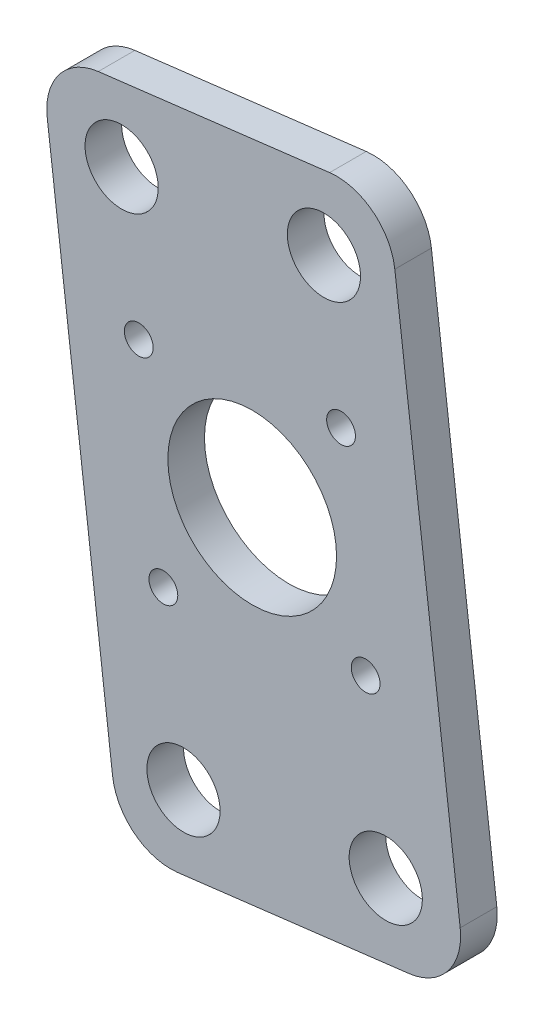
ISO-10303-21;
HEADER;
FILE_DESCRIPTION(('STEP AP214'),'2;1');
FILE_NAME('part.step','',(''),(''),'','','');
FILE_SCHEMA(('AUTOMOTIVE_DESIGN { 1 0 10303 214 1 1 1 1 }'));
ENDSEC;
DATA;
#1=APPLICATION_CONTEXT('core data for automotive mechanical design processes');
#2=APPLICATION_PROTOCOL_DEFINITION('international standard','automotive_design',2000,#1);
#3=PRODUCT_CONTEXT('',#1,'mechanical');
#4=PRODUCT('Part','Part','',(#3));
#5=PRODUCT_RELATED_PRODUCT_CATEGORY('part','',(#4));
#6=PRODUCT_DEFINITION_FORMATION('','',#4);
#7=PRODUCT_DEFINITION_CONTEXT('part definition',#1,'design');
#8=PRODUCT_DEFINITION('design','',#6,#7);
#9=PRODUCT_DEFINITION_SHAPE('','',#8);
#10=(LENGTH_UNIT() NAMED_UNIT(*) SI_UNIT(.MILLI.,.METRE.));
#11=(NAMED_UNIT(*) PLANE_ANGLE_UNIT() SI_UNIT($,.RADIAN.));
#12=(NAMED_UNIT(*) SI_UNIT($,.STERADIAN.) SOLID_ANGLE_UNIT());
#13=UNCERTAINTY_MEASURE_WITH_UNIT(LENGTH_MEASURE(1.E-05),#10,'distance_accuracy_value','');
#14=(GEOMETRIC_REPRESENTATION_CONTEXT(3) GLOBAL_UNCERTAINTY_ASSIGNED_CONTEXT((#13)) GLOBAL_UNIT_ASSIGNED_CONTEXT((#10,
#11,#12)) REPRESENTATION_CONTEXT('',''));
#15=CARTESIAN_POINT('',(0.,0.,0.));
#16=DIRECTION('',(0.,0.,1.));
#17=DIRECTION('',(1.,0.,0.));
#18=AXIS2_PLACEMENT_3D('',#15,#16,#17);
#19=CARTESIAN_POINT('',(-103.141929346554,-135.150875755682,3.175));
#20=DIRECTION('',(0.,0.,-1.));
#21=DIRECTION('',(-1.,0.,0.));
#22=AXIS2_PLACEMENT_3D('',#19,#20,#21);
#23=CYLINDRICAL_SURFACE('',#22,5.08000000000002);
#24=CARTESIAN_POINT('',(-103.141929346554,-135.150875755682,0.));
#25=DIRECTION('',(0.,0.,1.));
#26=DIRECTION('',(1.,0.,0.));
#27=AXIS2_PLACEMENT_3D('',#24,#25,#26);
#28=CIRCLE('',#27,5.08000000000002);
#29=CARTESIAN_POINT('',(-108.184781590121,-135.764097778734,0.));
#30=VERTEX_POINT('',#29);
#31=CARTESIAN_POINT('',(-103.755151369607,-130.108023512115,0.));
#32=VERTEX_POINT('',#31);
#33=EDGE_CURVE('E157',#30,#32,#28,.F.);
#34=ORIENTED_EDGE('',*,*,#33,.F.);
#35=DIRECTION('',(0.,0.,-1.));
#36=VECTOR('',#35,1.);
#37=CARTESIAN_POINT('',(-108.184781590121,-135.764097778734,3.175));
#38=LINE('',#37,#36);
#39=CARTESIAN_POINT('',(-108.184781590121,-135.764097778734,3.175));
#40=VERTEX_POINT('',#39);
#41=EDGE_CURVE('E11',#40,#30,#38,.T.);
#42=ORIENTED_EDGE('',*,*,#41,.F.);
#43=CARTESIAN_POINT('',(-103.141929346554,-135.150875755682,3.175));
#44=DIRECTION('',(0.,0.,1.));
#45=DIRECTION('',(1.,0.,0.));
#46=AXIS2_PLACEMENT_3D('',#43,#44,#45);
#47=CIRCLE('',#46,5.08000000000002);
#48=CARTESIAN_POINT('',(-103.755151369607,-130.108023512115,3.175));
#49=VERTEX_POINT('',#48);
#50=EDGE_CURVE('E280',#40,#49,#47,.F.);
#51=ORIENTED_EDGE('',*,*,#50,.T.);
#52=DIRECTION('',(0.,0.,-1.));
#53=VECTOR('',#52,1.);
#54=CARTESIAN_POINT('',(-103.755151369607,-130.108023512115,3.175));
#55=LINE('',#54,#53);
#56=EDGE_CURVE('E90',#49,#32,#55,.T.);
#57=ORIENTED_EDGE('',*,*,#56,.T.);
#58=EDGE_LOOP('',(#34,#42,#51,#57));
#59=FACE_BOUND('',#58,.T.);
#60=ADVANCED_FACE('F39',(#59),#23,.T.);
#61=CARTESIAN_POINT('',(-122.87700265867,-14.9421161909158,3.175));
#62=DIRECTION('',(0.992687449520956,0.1207129966639,0.));
#63=DIRECTION('',(-0.1207129966639,0.992687449520957,0.));
#64=AXIS2_PLACEMENT_3D('',#61,#62,#63);
#65=PLANE('',#64);
#66=DIRECTION('',(0.1207129966639,-0.992687449520957,0.));
#67=VECTOR('',#66,1.);
#68=CARTESIAN_POINT('',(-122.87700265867,-14.9421161909158,0.));
#69=LINE('',#68,#67);
#70=CARTESIAN_POINT('',(-102.512477876884,-182.410481031724,0.));
#71=VERTEX_POINT('',#70);
#72=EDGE_CURVE('E155',#30,#71,#69,.T.);
#73=ORIENTED_EDGE('',*,*,#72,.T.);
#74=DIRECTION('',(0.,0.,-1.));
#75=VECTOR('',#74,1.);
#76=CARTESIAN_POINT('',(-102.512477876884,-182.410481031724,3.175));
#77=LINE('',#76,#75);
#78=CARTESIAN_POINT('',(-102.512477876884,-182.410481031724,3.175));
#79=VERTEX_POINT('',#78);
#80=EDGE_CURVE('E48',#79,#71,#77,.T.);
#81=ORIENTED_EDGE('',*,*,#80,.F.);
#82=DIRECTION('',(0.1207129966639,-0.992687449520957,0.));
#83=VECTOR('',#82,1.);
#84=CARTESIAN_POINT('',(-122.87700265867,-14.9421161909158,3.175));
#85=LINE('',#84,#83);
#86=EDGE_CURVE('E282',#40,#79,#85,.T.);
#87=ORIENTED_EDGE('',*,*,#86,.F.);
#88=ORIENTED_EDGE('',*,*,#41,.T.);
#89=EDGE_LOOP('',(#73,#81,#87,#88));
#90=FACE_BOUND('',#89,.T.);
#91=ADVANCED_FACE('F156',(#90),#65,.F.);
#92=CARTESIAN_POINT('',(-97.4696256333176,-181.797259008671,3.175));
#93=DIRECTION('',(0.,0.,-1.));
#94=DIRECTION('',(-1.,0.,0.));
#95=AXIS2_PLACEMENT_3D('',#92,#93,#94);
#96=CYLINDRICAL_SURFACE('',#95,5.07999999999996);
#97=CARTESIAN_POINT('',(-97.4696256333176,-181.797259008671,0.));
#98=DIRECTION('',(0.,0.,1.));
#99=DIRECTION('',(1.,0.,0.));
#100=AXIS2_PLACEMENT_3D('',#97,#98,#99);
#101=CIRCLE('',#100,5.07999999999996);
#102=CARTESIAN_POINT('',(-96.856403610265,-186.840111252238,0.));
#103=VERTEX_POINT('',#102);
#104=EDGE_CURVE('E149',#71,#103,#101,.T.);
#105=ORIENTED_EDGE('',*,*,#104,.T.);
#106=DIRECTION('',(0.,0.,-1.));
#107=VECTOR('',#106,1.);
#108=CARTESIAN_POINT('',(-96.856403610265,-186.840111252238,3.175));
#109=LINE('',#108,#107);
#110=CARTESIAN_POINT('',(-96.856403610265,-186.840111252238,3.175));
#111=VERTEX_POINT('',#110);
#112=EDGE_CURVE('E140',#111,#103,#109,.T.);
#113=ORIENTED_EDGE('',*,*,#112,.F.);
#114=CARTESIAN_POINT('',(-97.4696256333176,-181.797259008671,3.175));
#115=DIRECTION('',(0.,0.,1.));
#116=DIRECTION('',(1.,0.,0.));
#117=AXIS2_PLACEMENT_3D('',#114,#115,#116);
#118=CIRCLE('',#117,5.07999999999996);
#119=EDGE_CURVE('E151',#79,#111,#118,.T.);
#120=ORIENTED_EDGE('',*,*,#119,.F.);
#121=ORIENTED_EDGE('',*,*,#80,.T.);
#122=EDGE_LOOP('',(#105,#113,#120,#121));
#123=FACE_BOUND('',#122,.T.);
#124=ADVANCED_FACE('F147',(#123),#96,.T.);
#125=CARTESIAN_POINT('',(20.9777468048383,-172.511217084375,3.175));
#126=DIRECTION('',(-0.120712996663899,0.992687449520957,0.));
#127=DIRECTION('',(-0.992687449520957,-0.120712996663899,0.));
#128=AXIS2_PLACEMENT_3D('',#125,#126,#127);
#129=PLANE('',#128);
#130=DIRECTION('',(0.992687449520957,0.120712996663899,0.));
#131=VECTOR('',#130,1.);
#132=CARTESIAN_POINT('',(20.9777468048383,-172.511217084375,0.));
#133=LINE('',#132,#131);
#134=CARTESIAN_POINT('',(-76.7865768096056,-184.399575777752,0.));
#135=VERTEX_POINT('',#134);
#136=EDGE_CURVE('E159',#103,#135,#133,.T.);
#137=ORIENTED_EDGE('',*,*,#136,.T.);
#138=DIRECTION('',(0.,0.,-1.));
#139=VECTOR('',#138,1.);
#140=CARTESIAN_POINT('',(-76.7865768096056,-184.399575777752,3.175));
#141=LINE('',#140,#139);
#142=CARTESIAN_POINT('',(-76.7865768096056,-184.399575777752,3.175));
#143=VERTEX_POINT('',#142);
#144=EDGE_CURVE('E133',#143,#135,#141,.T.);
#145=ORIENTED_EDGE('',*,*,#144,.F.);
#146=DIRECTION('',(0.992687449520957,0.120712996663899,0.));
#147=VECTOR('',#146,1.);
#148=CARTESIAN_POINT('',(20.9777468048383,-172.511217084375,3.175));
#149=LINE('',#148,#147);
#150=EDGE_CURVE('E287',#111,#143,#149,.T.);
#151=ORIENTED_EDGE('',*,*,#150,.F.);
#152=ORIENTED_EDGE('',*,*,#112,.T.);
#153=EDGE_LOOP('',(#137,#145,#151,#152));
#154=FACE_BOUND('',#153,.T.);
#155=ADVANCED_FACE('F234',(#154),#129,.F.);
#156=CARTESIAN_POINT('',(-77.3997988326582,-179.356723534185,3.175));
#157=DIRECTION('',(0.,0.,-1.));
#158=DIRECTION('',(-1.,0.,0.));
#159=AXIS2_PLACEMENT_3D('',#156,#157,#158);
#160=CYLINDRICAL_SURFACE('',#159,5.07999999999998);
#161=CARTESIAN_POINT('',(-77.3997988326582,-179.356723534185,0.));
#162=DIRECTION('',(0.,0.,1.));
#163=DIRECTION('',(1.,0.,0.));
#164=AXIS2_PLACEMENT_3D('',#161,#162,#163);
#165=CIRCLE('',#164,5.07999999999998);
#166=CARTESIAN_POINT('',(-72.3569465890917,-178.743501511133,0.));
#167=VERTEX_POINT('',#166);
#168=EDGE_CURVE('E167',#135,#167,#165,.T.);
#169=ORIENTED_EDGE('',*,*,#168,.T.);
#170=DIRECTION('',(0.,0.,-1.));
#171=VECTOR('',#170,1.);
#172=CARTESIAN_POINT('',(-72.3569465890917,-178.743501511133,3.175));
#173=LINE('',#172,#171);
#174=CARTESIAN_POINT('',(-72.3569465890917,-178.743501511133,3.175));
#175=VERTEX_POINT('',#174);
#176=EDGE_CURVE('E131',#175,#167,#173,.T.);
#177=ORIENTED_EDGE('',*,*,#176,.F.);
#178=CARTESIAN_POINT('',(-77.3997988326582,-179.356723534185,3.175));
#179=DIRECTION('',(0.,0.,1.));
#180=DIRECTION('',(1.,0.,0.));
#181=AXIS2_PLACEMENT_3D('',#178,#179,#180);
#182=CIRCLE('',#181,5.07999999999998);
#183=EDGE_CURVE('E124',#143,#175,#182,.T.);
#184=ORIENTED_EDGE('',*,*,#183,.F.);
#185=ORIENTED_EDGE('',*,*,#144,.T.);
#186=EDGE_LOOP('',(#169,#177,#184,#185));
#187=FACE_BOUND('',#186,.T.);
#188=ADVANCED_FACE('F237',(#187),#160,.T.);
#189=CARTESIAN_POINT('',(-92.7214713708774,-11.2751366703244,3.175));
#190=DIRECTION('',(-0.992687449520956,-0.120712996663899,0.));
#191=DIRECTION('',(0.120712996663899,-0.992687449520957,0.));
#192=AXIS2_PLACEMENT_3D('',#189,#190,#191);
#193=PLANE('',#192);
#194=DIRECTION('',(-0.120712996663899,0.992687449520957,0.));
#195=VECTOR('',#194,1.);
#196=CARTESIAN_POINT('',(-92.7214713708774,-11.2751366703244,0.));
#197=LINE('',#196,#195);
#198=CARTESIAN_POINT('',(-78.0292503023284,-132.097118258143,0.));
#199=VERTEX_POINT('',#198);
#200=EDGE_CURVE('E130',#167,#199,#197,.T.);
#201=ORIENTED_EDGE('',*,*,#200,.T.);
#202=DIRECTION('',(0.,0.,-1.));
#203=VECTOR('',#202,1.);
#204=CARTESIAN_POINT('',(-78.0292503023284,-132.097118258143,3.175));
#205=LINE('',#204,#203);
#206=CARTESIAN_POINT('',(-78.0292503023284,-132.097118258143,3.175));
#207=VERTEX_POINT('',#206);
#208=EDGE_CURVE('E115',#207,#199,#205,.T.);
#209=ORIENTED_EDGE('',*,*,#208,.F.);
#210=DIRECTION('',(-0.120712996663899,0.992687449520957,0.));
#211=VECTOR('',#210,1.);
#212=CARTESIAN_POINT('',(-92.7214713708774,-11.2751366703244,3.175));
#213=LINE('',#212,#211);
#214=EDGE_CURVE('E118',#175,#207,#213,.T.);
#215=ORIENTED_EDGE('',*,*,#214,.F.);
#216=ORIENTED_EDGE('',*,*,#176,.T.);
#217=EDGE_LOOP('',(#201,#209,#215,#216));
#218=FACE_BOUND('',#217,.T.);
#219=ADVANCED_FACE('F129',(#218),#193,.F.);
#220=CARTESIAN_POINT('',(-83.0721025458948,-132.710340281196,3.175));
#221=DIRECTION('',(0.,0.,-1.));
#222=DIRECTION('',(-1.,0.,0.));
#223=AXIS2_PLACEMENT_3D('',#220,#221,#222);
#224=CYLINDRICAL_SURFACE('',#223,5.08000000000002);
#225=CARTESIAN_POINT('',(-83.0721025458948,-132.710340281196,0.));
#226=DIRECTION('',(0.,0.,1.));
#227=DIRECTION('',(1.,0.,0.));
#228=AXIS2_PLACEMENT_3D('',#225,#226,#227);
#229=CIRCLE('',#228,5.08000000000002);
#230=CARTESIAN_POINT('',(-83.6853245689475,-127.667488037629,0.));
#231=VERTEX_POINT('',#230);
#232=EDGE_CURVE('E171',#199,#231,#229,.T.);
#233=ORIENTED_EDGE('',*,*,#232,.T.);
#234=DIRECTION('',(0.,0.,-1.));
#235=VECTOR('',#234,1.);
#236=CARTESIAN_POINT('',(-83.6853245689475,-127.667488037629,3.175));
#237=LINE('',#236,#235);
#238=CARTESIAN_POINT('',(-83.6853245689475,-127.667488037629,3.175));
#239=VERTEX_POINT('',#238);
#240=EDGE_CURVE('E117',#239,#231,#237,.T.);
#241=ORIENTED_EDGE('',*,*,#240,.F.);
#242=CARTESIAN_POINT('',(-83.0721025458948,-132.710340281196,3.175));
#243=DIRECTION('',(0.,0.,1.));
#244=DIRECTION('',(1.,0.,0.));
#245=AXIS2_PLACEMENT_3D('',#242,#243,#244);
#246=CIRCLE('',#245,5.08000000000002);
#247=EDGE_CURVE('E110',#207,#239,#246,.T.);
#248=ORIENTED_EDGE('',*,*,#247,.F.);
#249=ORIENTED_EDGE('',*,*,#208,.T.);
#250=EDGE_LOOP('',(#233,#241,#248,#249));
#251=FACE_BOUND('',#250,.T.);
#252=ADVANCED_FACE('F113',(#251),#224,.T.);
#253=CARTESIAN_POINT('',(-80.55927811051,-163.895460225963,3.175));
#254=DIRECTION('',(0.,0.,-1.));
#255=DIRECTION('',(-1.,0.,0.));
#256=AXIS2_PLACEMENT_3D('',#253,#254,#255);
#257=CYLINDRICAL_SURFACE('',#256,1.25);
#258=CARTESIAN_POINT('',(-80.55927811051,-163.895460225963,3.175));
#259=DIRECTION('',(0.,0.,1.));
#260=DIRECTION('',(1.,0.,0.));
#261=AXIS2_PLACEMENT_3D('',#258,#259,#260);
#262=CIRCLE('',#261,1.25);
#263=CARTESIAN_POINT('',(-79.30927811051,-163.895460225963,3.175));
#264=VERTEX_POINT('',#263);
#265=EDGE_CURVE('E200',#264,#264,#262,.T.);
#266=ORIENTED_EDGE('',*,*,#265,.T.);
#267=EDGE_LOOP('',(#266));
#268=FACE_BOUND('',#267,.T.);
#269=CARTESIAN_POINT('',(-80.55927811051,-163.895460225963,0.));
#270=DIRECTION('',(0.,0.,1.));
#271=DIRECTION('',(1.,0.,0.));
#272=AXIS2_PLACEMENT_3D('',#269,#270,#271);
#273=CIRCLE('',#272,1.25);
#274=CARTESIAN_POINT('',(-79.30927811051,-163.895460225963,0.));
#275=VERTEX_POINT('',#274);
#276=EDGE_CURVE('E192',#275,#275,#273,.T.);
#277=ORIENTED_EDGE('',*,*,#276,.F.);
#278=EDGE_LOOP('',(#277));
#279=FACE_BOUND('',#278,.T.);
#280=ADVANCED_FACE('F245',(#268,#279),#257,.F.);
#281=CARTESIAN_POINT('',(-82.6932025734698,-146.347059547087,3.175));
#282=DIRECTION('',(0.,0.,-1.));
#283=DIRECTION('',(-1.,0.,0.));
#284=AXIS2_PLACEMENT_3D('',#281,#282,#283);
#285=CYLINDRICAL_SURFACE('',#284,1.25);
#286=CARTESIAN_POINT('',(-82.6932025734698,-146.347059547087,3.175));
#287=DIRECTION('',(0.,0.,1.));
#288=DIRECTION('',(1.,0.,0.));
#289=AXIS2_PLACEMENT_3D('',#286,#287,#288);
#290=CIRCLE('',#289,1.25);
#291=CARTESIAN_POINT('',(-81.4432025734698,-146.347059547087,3.175));
#292=VERTEX_POINT('',#291);
#293=EDGE_CURVE('E205',#292,#292,#290,.T.);
#294=ORIENTED_EDGE('',*,*,#293,.T.);
#295=EDGE_LOOP('',(#294));
#296=FACE_BOUND('',#295,.T.);
#297=CARTESIAN_POINT('',(-82.6932025734698,-146.347059547087,0.));
#298=DIRECTION('',(0.,0.,1.));
#299=DIRECTION('',(1.,0.,0.));
#300=AXIS2_PLACEMENT_3D('',#297,#298,#299);
#301=CIRCLE('',#300,1.25);
#302=CARTESIAN_POINT('',(-81.4432025734698,-146.347059547087,0.));
#303=VERTEX_POINT('',#302);
#304=EDGE_CURVE('E189',#303,#303,#301,.T.);
#305=ORIENTED_EDGE('',*,*,#304,.F.);
#306=EDGE_LOOP('',(#305));
#307=FACE_BOUND('',#306,.T.);
#308=ADVANCED_FACE('F265',(#296,#307),#285,.F.);
#309=CARTESIAN_POINT('',(-100.241603252346,-148.480984010047,3.175));
#310=DIRECTION('',(0.,0.,-1.));
#311=DIRECTION('',(-1.,0.,0.));
#312=AXIS2_PLACEMENT_3D('',#309,#310,#311);
#313=CYLINDRICAL_SURFACE('',#312,1.25);
#314=CARTESIAN_POINT('',(-100.241603252346,-148.480984010047,3.175));
#315=DIRECTION('',(0.,0.,1.));
#316=DIRECTION('',(1.,0.,0.));
#317=AXIS2_PLACEMENT_3D('',#314,#315,#316);
#318=CIRCLE('',#317,1.25);
#319=CARTESIAN_POINT('',(-98.991603252346,-148.480984010047,3.175));
#320=VERTEX_POINT('',#319);
#321=EDGE_CURVE('E303',#320,#320,#318,.T.);
#322=ORIENTED_EDGE('',*,*,#321,.T.);
#323=EDGE_LOOP('',(#322));
#324=FACE_BOUND('',#323,.T.);
#325=CARTESIAN_POINT('',(-100.241603252346,-148.480984010047,0.));
#326=DIRECTION('',(0.,0.,1.));
#327=DIRECTION('',(1.,0.,0.));
#328=AXIS2_PLACEMENT_3D('',#325,#326,#327);
#329=CIRCLE('',#328,1.25);
#330=CARTESIAN_POINT('',(-98.991603252346,-148.480984010047,0.));
#331=VERTEX_POINT('',#330);
#332=EDGE_CURVE('E186',#331,#331,#329,.T.);
#333=ORIENTED_EDGE('',*,*,#332,.F.);
#334=EDGE_LOOP('',(#333));
#335=FACE_BOUND('',#334,.T.);
#336=ADVANCED_FACE('F261',(#324,#335),#313,.F.);
#337=CARTESIAN_POINT('',(-101.7279107799,-136.25828331081,3.175));
#338=DIRECTION('',(0.,0.,-1.));
#339=DIRECTION('',(-1.,0.,0.));
#340=AXIS2_PLACEMENT_3D('',#337,#338,#339);
#341=CYLINDRICAL_SURFACE('',#340,3.175);
#342=CARTESIAN_POINT('',(-101.7279107799,-136.25828331081,3.175));
#343=DIRECTION('',(0.,0.,1.));
#344=DIRECTION('',(1.,0.,0.));
#345=AXIS2_PLACEMENT_3D('',#342,#343,#344);
#346=CIRCLE('',#345,3.175);
#347=CARTESIAN_POINT('',(-98.5529107798995,-136.25828331081,3.175));
#348=VERTEX_POINT('',#347);
#349=EDGE_CURVE('E300',#348,#348,#346,.T.);
#350=ORIENTED_EDGE('',*,*,#349,.T.);
#351=EDGE_LOOP('',(#350));
#352=FACE_BOUND('',#351,.T.);
#353=CARTESIAN_POINT('',(-101.7279107799,-136.25828331081,0.));
#354=DIRECTION('',(0.,0.,1.));
#355=DIRECTION('',(1.,0.,0.));
#356=AXIS2_PLACEMENT_3D('',#353,#354,#355);
#357=CIRCLE('',#356,3.175);
#358=CARTESIAN_POINT('',(-98.5529107798995,-136.25828331081,0.));
#359=VERTEX_POINT('',#358);
#360=EDGE_CURVE('E183',#359,#359,#357,.T.);
#361=ORIENTED_EDGE('',*,*,#360,.F.);
#362=EDGE_LOOP('',(#361));
#363=FACE_BOUND('',#362,.T.);
#364=ADVANCED_FACE('F257',(#352,#363),#341,.F.);
#365=CARTESIAN_POINT('',(-84.1795101010233,-134.12435884785,3.175));
#366=DIRECTION('',(0.,0.,-1.));
#367=DIRECTION('',(-1.,0.,0.));
#368=AXIS2_PLACEMENT_3D('',#365,#366,#367);
#369=CYLINDRICAL_SURFACE('',#368,3.175);
#370=CARTESIAN_POINT('',(-84.1795101010233,-134.12435884785,3.175));
#371=DIRECTION('',(0.,0.,1.));
#372=DIRECTION('',(1.,0.,0.));
#373=AXIS2_PLACEMENT_3D('',#370,#371,#372);
#374=CIRCLE('',#373,3.175);
#375=CARTESIAN_POINT('',(-81.0045101010233,-134.12435884785,3.175));
#376=VERTEX_POINT('',#375);
#377=EDGE_CURVE('E297',#376,#376,#374,.T.);
#378=ORIENTED_EDGE('',*,*,#377,.T.);
#379=EDGE_LOOP('',(#378));
#380=FACE_BOUND('',#379,.T.);
#381=CARTESIAN_POINT('',(-84.1795101010233,-134.12435884785,0.));
#382=DIRECTION('',(0.,0.,1.));
#383=DIRECTION('',(1.,0.,0.));
#384=AXIS2_PLACEMENT_3D('',#381,#382,#383);
#385=CIRCLE('',#384,3.175);
#386=CARTESIAN_POINT('',(-81.0045101010233,-134.12435884785,0.));
#387=VERTEX_POINT('',#386);
#388=EDGE_CURVE('E180',#387,#387,#385,.T.);
#389=ORIENTED_EDGE('',*,*,#388,.F.);
#390=EDGE_LOOP('',(#389));
#391=FACE_BOUND('',#390,.T.);
#392=ADVANCED_FACE('F253',(#380,#391),#369,.F.);
#393=CARTESIAN_POINT('',(-78.813817399313,-178.249315979057,3.175));
#394=DIRECTION('',(0.,0.,-1.));
#395=DIRECTION('',(-1.,0.,0.));
#396=AXIS2_PLACEMENT_3D('',#393,#394,#395);
#397=CYLINDRICAL_SURFACE('',#396,3.175);
#398=CARTESIAN_POINT('',(-78.813817399313,-178.249315979057,3.175));
#399=DIRECTION('',(0.,0.,1.));
#400=DIRECTION('',(1.,0.,0.));
#401=AXIS2_PLACEMENT_3D('',#398,#399,#400);
#402=CIRCLE('',#401,3.175);
#403=CARTESIAN_POINT('',(-75.638817399313,-178.249315979057,3.175));
#404=VERTEX_POINT('',#403);
#405=EDGE_CURVE('E294',#404,#404,#402,.T.);
#406=ORIENTED_EDGE('',*,*,#405,.T.);
#407=EDGE_LOOP('',(#406));
#408=FACE_BOUND('',#407,.T.);
#409=CARTESIAN_POINT('',(-78.813817399313,-178.249315979057,0.));
#410=DIRECTION('',(0.,0.,1.));
#411=DIRECTION('',(1.,0.,0.));
#412=AXIS2_PLACEMENT_3D('',#409,#410,#411);
#413=CIRCLE('',#412,3.175);
#414=CARTESIAN_POINT('',(-75.638817399313,-178.249315979057,0.));
#415=VERTEX_POINT('',#414);
#416=EDGE_CURVE('E177',#415,#415,#413,.T.);
#417=ORIENTED_EDGE('',*,*,#416,.F.);
#418=EDGE_LOOP('',(#417));
#419=FACE_BOUND('',#418,.T.);
#420=ADVANCED_FACE('F249',(#408,#419),#397,.F.);
#421=CARTESIAN_POINT('',(-96.3622180781892,-180.383240442017,3.175));
#422=DIRECTION('',(0.,0.,-1.));
#423=DIRECTION('',(-1.,0.,0.));
#424=AXIS2_PLACEMENT_3D('',#421,#422,#423);
#425=CYLINDRICAL_SURFACE('',#424,3.175);
#426=CARTESIAN_POINT('',(-96.3622180781892,-180.383240442017,3.175));
#427=DIRECTION('',(0.,0.,1.));
#428=DIRECTION('',(1.,0.,0.));
#429=AXIS2_PLACEMENT_3D('',#426,#427,#428);
#430=CIRCLE('',#429,3.175);
#431=CARTESIAN_POINT('',(-93.1872180781892,-180.383240442017,3.175));
#432=VERTEX_POINT('',#431);
#433=EDGE_CURVE('E291',#432,#432,#430,.T.);
#434=ORIENTED_EDGE('',*,*,#433,.T.);
#435=EDGE_LOOP('',(#434));
#436=FACE_BOUND('',#435,.T.);
#437=CARTESIAN_POINT('',(-96.3622180781892,-180.383240442017,0.));
#438=DIRECTION('',(0.,0.,1.));
#439=DIRECTION('',(1.,0.,0.));
#440=AXIS2_PLACEMENT_3D('',#437,#438,#439);
#441=CIRCLE('',#440,3.175);
#442=CARTESIAN_POINT('',(-93.1872180781892,-180.383240442017,0.));
#443=VERTEX_POINT('',#442);
#444=EDGE_CURVE('E174',#443,#443,#441,.T.);
#445=ORIENTED_EDGE('',*,*,#444,.F.);
#446=EDGE_LOOP('',(#445));
#447=FACE_BOUND('',#446,.T.);
#448=ADVANCED_FACE('F222',(#436,#447),#425,.F.);
#449=CARTESIAN_POINT('',(14.0789990454964,-115.779129344252,3.175));
#450=DIRECTION('',(0.120712996663899,-0.992687449520957,0.));
#451=DIRECTION('',(0.992687449520957,0.120712996663899,0.));
#452=AXIS2_PLACEMENT_3D('',#449,#450,#451);
#453=PLANE('',#452);
#454=DIRECTION('',(-0.992687449520957,-0.120712996663899,0.));
#455=VECTOR('',#454,1.);
#456=CARTESIAN_POINT('',(14.0789990454964,-115.779129344252,0.));
#457=LINE('',#456,#455);
#458=EDGE_CURVE('E83',#231,#32,#457,.T.);
#459=ORIENTED_EDGE('',*,*,#458,.T.);
#460=ORIENTED_EDGE('',*,*,#56,.F.);
#461=DIRECTION('',(-0.992687449520957,-0.120712996663899,0.));
#462=VECTOR('',#461,1.);
#463=CARTESIAN_POINT('',(14.0789990454964,-115.779129344252,3.175));
#464=LINE('',#463,#462);
#465=EDGE_CURVE('E56',#239,#49,#464,.T.);
#466=ORIENTED_EDGE('',*,*,#465,.F.);
#467=ORIENTED_EDGE('',*,*,#240,.T.);
#468=EDGE_LOOP('',(#459,#460,#466,#467));
#469=FACE_BOUND('',#468,.T.);
#470=ADVANCED_FACE('F215',(#469),#453,.F.);
#471=CARTESIAN_POINT('',(-90.4004406814277,-156.188222118006,3.175));
#472=DIRECTION('',(0.,0.,-1.));
#473=DIRECTION('',(-1.,0.,0.));
#474=AXIS2_PLACEMENT_3D('',#471,#472,#473);
#475=CYLINDRICAL_SURFACE('',#474,7.31716739185122);
#476=CARTESIAN_POINT('',(-90.4004406814277,-156.188222118006,3.175));
#477=DIRECTION('',(0.,0.,1.));
#478=DIRECTION('',(1.,0.,0.));
#479=AXIS2_PLACEMENT_3D('',#476,#477,#478);
#480=CIRCLE('',#479,7.31716739185122);
#481=CARTESIAN_POINT('',(-83.0832732895765,-156.188222118006,3.175));
#482=VERTEX_POINT('',#481);
#483=EDGE_CURVE('E197',#482,#482,#480,.T.);
#484=ORIENTED_EDGE('',*,*,#483,.T.);
#485=EDGE_LOOP('',(#484));
#486=FACE_BOUND('',#485,.T.);
#487=CARTESIAN_POINT('',(-90.4004406814277,-156.188222118006,0.));
#488=DIRECTION('',(0.,0.,1.));
#489=DIRECTION('',(1.,0.,0.));
#490=AXIS2_PLACEMENT_3D('',#487,#488,#489);
#491=CIRCLE('',#490,7.31716739185122);
#492=CARTESIAN_POINT('',(-83.0832732895765,-156.188222118006,0.));
#493=VERTEX_POINT('',#492);
#494=EDGE_CURVE('E161',#493,#493,#491,.T.);
#495=ORIENTED_EDGE('',*,*,#494,.F.);
#496=EDGE_LOOP('',(#495));
#497=FACE_BOUND('',#496,.T.);
#498=ADVANCED_FACE('F41',(#486,#497),#475,.F.);
#499=CARTESIAN_POINT('',(-98.1076787893862,-166.029384688923,3.175));
#500=DIRECTION('',(0.,0.,-1.));
#501=DIRECTION('',(-1.,0.,0.));
#502=AXIS2_PLACEMENT_3D('',#499,#500,#501);
#503=CYLINDRICAL_SURFACE('',#502,1.25);
#504=CARTESIAN_POINT('',(-98.1076787893862,-166.029384688923,3.175));
#505=DIRECTION('',(0.,0.,1.));
#506=DIRECTION('',(1.,0.,0.));
#507=AXIS2_PLACEMENT_3D('',#504,#505,#506);
#508=CIRCLE('',#507,1.25);
#509=CARTESIAN_POINT('',(-96.8576787893862,-166.029384688923,3.175));
#510=VERTEX_POINT('',#509);
#511=EDGE_CURVE('E198',#510,#510,#508,.T.);
#512=ORIENTED_EDGE('',*,*,#511,.T.);
#513=EDGE_LOOP('',(#512));
#514=FACE_BOUND('',#513,.T.);
#515=CARTESIAN_POINT('',(-98.1076787893862,-166.029384688923,0.));
#516=DIRECTION('',(0.,0.,1.));
#517=DIRECTION('',(1.,0.,0.));
#518=AXIS2_PLACEMENT_3D('',#515,#516,#517);
#519=CIRCLE('',#518,1.25);
#520=CARTESIAN_POINT('',(-96.8576787893862,-166.029384688923,0.));
#521=VERTEX_POINT('',#520);
#522=EDGE_CURVE('E195',#521,#521,#519,.T.);
#523=ORIENTED_EDGE('',*,*,#522,.F.);
#524=EDGE_LOOP('',(#523));
#525=FACE_BOUND('',#524,.T.);
#526=ADVANCED_FACE('F214',(#514,#525),#503,.F.);
#527=CARTESIAN_POINT('',(0.,0.,3.175));
#528=DIRECTION('',(0.,0.,1.));
#529=DIRECTION('',(1.,0.,0.));
#530=AXIS2_PLACEMENT_3D('',#527,#528,#529);
#531=PLANE('',#530);
#532=ORIENTED_EDGE('',*,*,#483,.F.);
#533=EDGE_LOOP('',(#532));
#534=FACE_BOUND('',#533,.T.);
#535=ORIENTED_EDGE('',*,*,#50,.F.);
#536=ORIENTED_EDGE('',*,*,#86,.T.);
#537=ORIENTED_EDGE('',*,*,#119,.T.);
#538=ORIENTED_EDGE('',*,*,#150,.T.);
#539=ORIENTED_EDGE('',*,*,#183,.T.);
#540=ORIENTED_EDGE('',*,*,#214,.T.);
#541=ORIENTED_EDGE('',*,*,#247,.T.);
#542=ORIENTED_EDGE('',*,*,#465,.T.);
#543=EDGE_LOOP('',(#535,#536,#537,#538,#539,#540,#541,#542));
#544=FACE_BOUND('',#543,.T.);
#545=ORIENTED_EDGE('',*,*,#433,.F.);
#546=EDGE_LOOP('',(#545));
#547=FACE_BOUND('',#546,.T.);
#548=ORIENTED_EDGE('',*,*,#405,.F.);
#549=EDGE_LOOP('',(#548));
#550=FACE_BOUND('',#549,.T.);
#551=ORIENTED_EDGE('',*,*,#377,.F.);
#552=EDGE_LOOP('',(#551));
#553=FACE_BOUND('',#552,.T.);
#554=ORIENTED_EDGE('',*,*,#349,.F.);
#555=EDGE_LOOP('',(#554));
#556=FACE_BOUND('',#555,.T.);
#557=ORIENTED_EDGE('',*,*,#321,.F.);
#558=EDGE_LOOP('',(#557));
#559=FACE_BOUND('',#558,.T.);
#560=ORIENTED_EDGE('',*,*,#293,.F.);
#561=EDGE_LOOP('',(#560));
#562=FACE_BOUND('',#561,.T.);
#563=ORIENTED_EDGE('',*,*,#265,.F.);
#564=EDGE_LOOP('',(#563));
#565=FACE_BOUND('',#564,.T.);
#566=ORIENTED_EDGE('',*,*,#511,.F.);
#567=EDGE_LOOP('',(#566));
#568=FACE_BOUND('',#567,.T.);
#569=ADVANCED_FACE('F121',(#534,#544,#547,#550,#553,#556,#559,#562,#565,#568),#531,.T.);
#570=CARTESIAN_POINT('',(0.,0.,0.));
#571=DIRECTION('',(0.,0.,1.));
#572=DIRECTION('',(1.,0.,0.));
#573=AXIS2_PLACEMENT_3D('',#570,#571,#572);
#574=PLANE('',#573);
#575=ORIENTED_EDGE('',*,*,#494,.T.);
#576=EDGE_LOOP('',(#575));
#577=FACE_BOUND('',#576,.T.);
#578=ORIENTED_EDGE('',*,*,#33,.T.);
#579=ORIENTED_EDGE('',*,*,#458,.F.);
#580=ORIENTED_EDGE('',*,*,#232,.F.);
#581=ORIENTED_EDGE('',*,*,#200,.F.);
#582=ORIENTED_EDGE('',*,*,#168,.F.);
#583=ORIENTED_EDGE('',*,*,#136,.F.);
#584=ORIENTED_EDGE('',*,*,#104,.F.);
#585=ORIENTED_EDGE('',*,*,#72,.F.);
#586=EDGE_LOOP('',(#578,#579,#580,#581,#582,#583,#584,#585));
#587=FACE_BOUND('',#586,.T.);
#588=ORIENTED_EDGE('',*,*,#444,.T.);
#589=EDGE_LOOP('',(#588));
#590=FACE_BOUND('',#589,.T.);
#591=ORIENTED_EDGE('',*,*,#416,.T.);
#592=EDGE_LOOP('',(#591));
#593=FACE_BOUND('',#592,.T.);
#594=ORIENTED_EDGE('',*,*,#388,.T.);
#595=EDGE_LOOP('',(#594));
#596=FACE_BOUND('',#595,.T.);
#597=ORIENTED_EDGE('',*,*,#360,.T.);
#598=EDGE_LOOP('',(#597));
#599=FACE_BOUND('',#598,.T.);
#600=ORIENTED_EDGE('',*,*,#332,.T.);
#601=EDGE_LOOP('',(#600));
#602=FACE_BOUND('',#601,.T.);
#603=ORIENTED_EDGE('',*,*,#304,.T.);
#604=EDGE_LOOP('',(#603));
#605=FACE_BOUND('',#604,.T.);
#606=ORIENTED_EDGE('',*,*,#276,.T.);
#607=EDGE_LOOP('',(#606));
#608=FACE_BOUND('',#607,.T.);
#609=ORIENTED_EDGE('',*,*,#522,.T.);
#610=EDGE_LOOP('',(#609));
#611=FACE_BOUND('',#610,.T.);
#612=ADVANCED_FACE('F211',(#577,#587,#590,#593,#596,#599,#602,#605,#608,#611),#574,.F.);
#613=CLOSED_SHELL('',(#60,#91,#124,#155,#188,#219,#252,#280,#308,#336,#364,#392,#420,#448,#470,
#498,#526,#569,#612));
#614=MANIFOLD_SOLID_BREP('B2',#613);
#615=ADVANCED_BREP_SHAPE_REPRESENTATION('',(#18,#614),#14);
#616=SHAPE_DEFINITION_REPRESENTATION(#9,#615);
ENDSEC;
END-ISO-10303-21;
